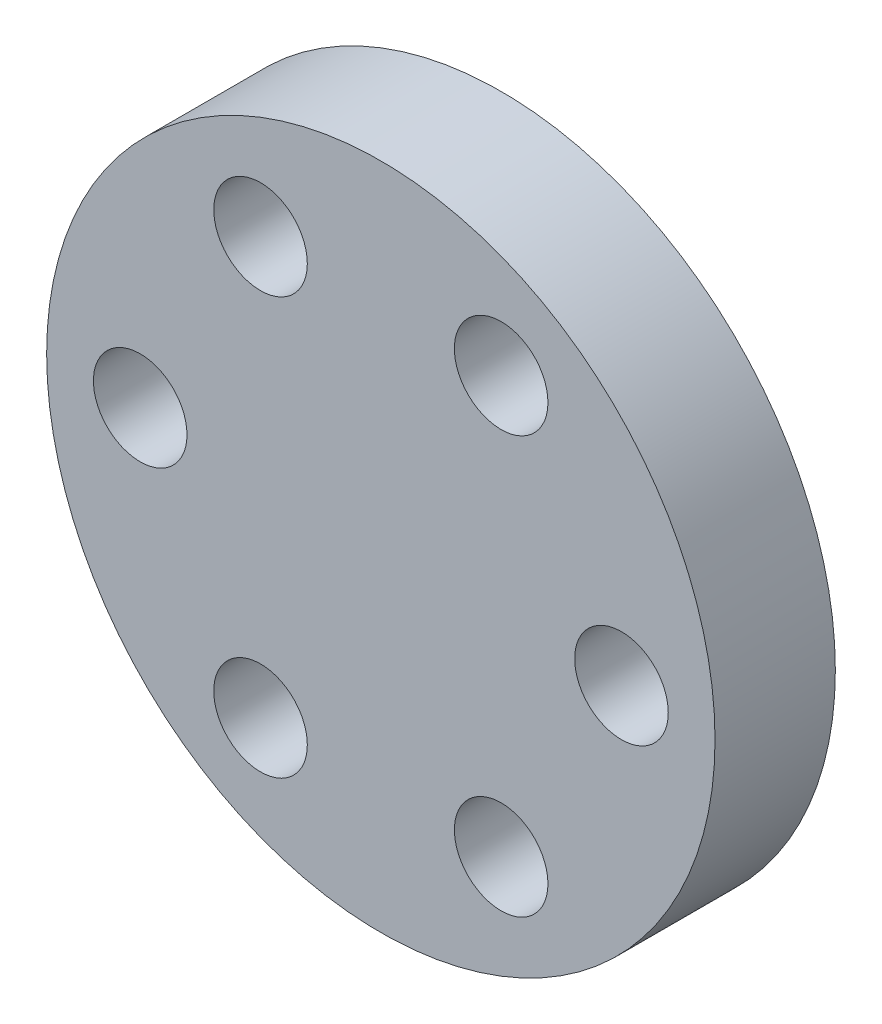
ISO-10303-21;
HEADER;
FILE_DESCRIPTION(('STEP AP214'),'2;1');
FILE_NAME('part.step','',(''),(''),'','','');
FILE_SCHEMA(('AUTOMOTIVE_DESIGN { 1 0 10303 214 1 1 1 1 }'));
ENDSEC;
DATA;
#1=APPLICATION_CONTEXT('core data for automotive mechanical design processes');
#2=APPLICATION_PROTOCOL_DEFINITION('international standard','automotive_design',2000,#1);
#3=PRODUCT_CONTEXT('',#1,'mechanical');
#4=PRODUCT('Part','Part','',(#3));
#5=PRODUCT_RELATED_PRODUCT_CATEGORY('part','',(#4));
#6=PRODUCT_DEFINITION_FORMATION('','',#4);
#7=PRODUCT_DEFINITION_CONTEXT('part definition',#1,'design');
#8=PRODUCT_DEFINITION('design','',#6,#7);
#9=PRODUCT_DEFINITION_SHAPE('','',#8);
#10=(LENGTH_UNIT() NAMED_UNIT(*) SI_UNIT(.MILLI.,.METRE.));
#11=(NAMED_UNIT(*) PLANE_ANGLE_UNIT() SI_UNIT($,.RADIAN.));
#12=(NAMED_UNIT(*) SI_UNIT($,.STERADIAN.) SOLID_ANGLE_UNIT());
#13=UNCERTAINTY_MEASURE_WITH_UNIT(LENGTH_MEASURE(1.E-05),#10,'distance_accuracy_value','');
#14=(GEOMETRIC_REPRESENTATION_CONTEXT(3) GLOBAL_UNCERTAINTY_ASSIGNED_CONTEXT((#13)) GLOBAL_UNIT_ASSIGNED_CONTEXT((#10,
#11,#12)) REPRESENTATION_CONTEXT('',''));
#15=CARTESIAN_POINT('',(0.,0.,0.));
#16=DIRECTION('',(0.,0.,1.));
#17=DIRECTION('',(1.,0.,0.));
#18=AXIS2_PLACEMENT_3D('',#15,#16,#17);
#19=CARTESIAN_POINT('',(0.,0.,28.575));
#20=DIRECTION('',(0.,0.,1.));
#21=DIRECTION('',(1.,0.,0.));
#22=AXIS2_PLACEMENT_3D('',#19,#20,#21);
#23=PLANE('',#22);
#24=CARTESIAN_POINT('',(57.1500000000001,-98.9867036525613,28.575));
#25=DIRECTION('',(0.,0.,1.));
#26=DIRECTION('',(1.,0.,0.));
#27=AXIS2_PLACEMENT_3D('',#24,#25,#26);
#28=CIRCLE('',#27,22.225);
#29=CARTESIAN_POINT('',(79.3750000000001,-98.9867036525613,28.575));
#30=VERTEX_POINT('',#29);
#31=EDGE_CURVE('E86',#30,#30,#28,.T.);
#32=ORIENTED_EDGE('',*,*,#31,.F.);
#33=EDGE_LOOP('',(#32));
#34=FACE_BOUND('',#33,.T.);
#35=CARTESIAN_POINT('',(57.15,98.9867036525613,28.575));
#36=DIRECTION('',(0.,0.,1.));
#37=DIRECTION('',(1.,0.,0.));
#38=AXIS2_PLACEMENT_3D('',#35,#36,#37);
#39=CIRCLE('',#38,22.225);
#40=CARTESIAN_POINT('',(79.375,98.9867036525613,28.575));
#41=VERTEX_POINT('',#40);
#42=EDGE_CURVE('E70',#41,#41,#39,.T.);
#43=ORIENTED_EDGE('',*,*,#42,.F.);
#44=EDGE_LOOP('',(#43));
#45=FACE_BOUND('',#44,.T.);
#46=CARTESIAN_POINT('',(-114.3,0.,28.575));
#47=DIRECTION('',(0.,0.,1.));
#48=DIRECTION('',(1.,0.,0.));
#49=AXIS2_PLACEMENT_3D('',#46,#47,#48);
#50=CIRCLE('',#49,22.225);
#51=CARTESIAN_POINT('',(-92.075,0.,28.575));
#52=VERTEX_POINT('',#51);
#53=EDGE_CURVE('E56',#52,#52,#50,.T.);
#54=ORIENTED_EDGE('',*,*,#53,.F.);
#55=EDGE_LOOP('',(#54));
#56=FACE_BOUND('',#55,.T.);
#57=CARTESIAN_POINT('',(0.,0.,28.575));
#58=DIRECTION('',(0.,0.,1.));
#59=DIRECTION('',(1.,0.,0.));
#60=AXIS2_PLACEMENT_3D('',#57,#58,#59);
#61=CIRCLE('',#60,158.75);
#62=CARTESIAN_POINT('',(158.75,0.,28.575));
#63=VERTEX_POINT('',#62);
#64=EDGE_CURVE('E10',#63,#63,#61,.T.);
#65=ORIENTED_EDGE('',*,*,#64,.T.);
#66=EDGE_LOOP('',(#65));
#67=FACE_BOUND('',#66,.T.);
#68=CARTESIAN_POINT('',(-57.15,98.9867036525613,28.575));
#69=DIRECTION('',(0.,0.,1.));
#70=DIRECTION('',(1.,0.,0.));
#71=AXIS2_PLACEMENT_3D('',#68,#69,#70);
#72=CIRCLE('',#71,22.225);
#73=CARTESIAN_POINT('',(-34.925,98.9867036525613,28.575));
#74=VERTEX_POINT('',#73);
#75=EDGE_CURVE('E62',#74,#74,#72,.T.);
#76=ORIENTED_EDGE('',*,*,#75,.F.);
#77=EDGE_LOOP('',(#76));
#78=FACE_BOUND('',#77,.T.);
#79=CARTESIAN_POINT('',(114.3,0.,28.575));
#80=DIRECTION('',(0.,0.,1.));
#81=DIRECTION('',(1.,0.,0.));
#82=AXIS2_PLACEMENT_3D('',#79,#80,#81);
#83=CIRCLE('',#82,22.225);
#84=CARTESIAN_POINT('',(136.525,0.,28.575));
#85=VERTEX_POINT('',#84);
#86=EDGE_CURVE('E78',#85,#85,#83,.T.);
#87=ORIENTED_EDGE('',*,*,#86,.F.);
#88=EDGE_LOOP('',(#87));
#89=FACE_BOUND('',#88,.T.);
#90=CARTESIAN_POINT('',(-57.15,-98.9867036525613,28.575));
#91=DIRECTION('',(0.,0.,1.));
#92=DIRECTION('',(1.,0.,0.));
#93=AXIS2_PLACEMENT_3D('',#90,#91,#92);
#94=CIRCLE('',#93,22.225);
#95=CARTESIAN_POINT('',(-34.925,-98.9867036525613,28.575));
#96=VERTEX_POINT('',#95);
#97=EDGE_CURVE('E94',#96,#96,#94,.T.);
#98=ORIENTED_EDGE('',*,*,#97,.F.);
#99=EDGE_LOOP('',(#98));
#100=FACE_BOUND('',#99,.T.);
#101=ADVANCED_FACE('F43',(#34,#45,#56,#67,#78,#89,#100),#23,.T.);
#102=CARTESIAN_POINT('',(0.,0.,-28.575));
#103=DIRECTION('',(0.,0.,1.));
#104=DIRECTION('',(1.,0.,0.));
#105=AXIS2_PLACEMENT_3D('',#102,#103,#104);
#106=PLANE('',#105);
#107=CARTESIAN_POINT('',(0.,0.,-28.575));
#108=DIRECTION('',(0.,0.,1.));
#109=DIRECTION('',(1.,0.,0.));
#110=AXIS2_PLACEMENT_3D('',#107,#108,#109);
#111=CIRCLE('',#110,158.75);
#112=CARTESIAN_POINT('',(158.75,0.,-28.575));
#113=VERTEX_POINT('',#112);
#114=EDGE_CURVE('E47',#113,#113,#111,.T.);
#115=ORIENTED_EDGE('',*,*,#114,.F.);
#116=EDGE_LOOP('',(#115));
#117=FACE_BOUND('',#116,.T.);
#118=CARTESIAN_POINT('',(-114.3,0.,-28.575));
#119=DIRECTION('',(0.,0.,1.));
#120=DIRECTION('',(1.,0.,0.));
#121=AXIS2_PLACEMENT_3D('',#118,#119,#120);
#122=CIRCLE('',#121,22.225);
#123=CARTESIAN_POINT('',(-92.075,0.,-28.575));
#124=VERTEX_POINT('',#123);
#125=EDGE_CURVE('E58',#124,#124,#122,.T.);
#126=ORIENTED_EDGE('',*,*,#125,.T.);
#127=EDGE_LOOP('',(#126));
#128=FACE_BOUND('',#127,.T.);
#129=CARTESIAN_POINT('',(-57.15,98.9867036525613,-28.575));
#130=DIRECTION('',(0.,0.,1.));
#131=DIRECTION('',(1.,0.,0.));
#132=AXIS2_PLACEMENT_3D('',#129,#130,#131);
#133=CIRCLE('',#132,22.225);
#134=CARTESIAN_POINT('',(-34.925,98.9867036525613,-28.575));
#135=VERTEX_POINT('',#134);
#136=EDGE_CURVE('E66',#135,#135,#133,.T.);
#137=ORIENTED_EDGE('',*,*,#136,.T.);
#138=EDGE_LOOP('',(#137));
#139=FACE_BOUND('',#138,.T.);
#140=CARTESIAN_POINT('',(57.15,98.9867036525613,-28.575));
#141=DIRECTION('',(0.,0.,1.));
#142=DIRECTION('',(1.,0.,0.));
#143=AXIS2_PLACEMENT_3D('',#140,#141,#142);
#144=CIRCLE('',#143,22.225);
#145=CARTESIAN_POINT('',(79.375,98.9867036525613,-28.575));
#146=VERTEX_POINT('',#145);
#147=EDGE_CURVE('E74',#146,#146,#144,.T.);
#148=ORIENTED_EDGE('',*,*,#147,.T.);
#149=EDGE_LOOP('',(#148));
#150=FACE_BOUND('',#149,.T.);
#151=CARTESIAN_POINT('',(114.3,0.,-28.575));
#152=DIRECTION('',(0.,0.,1.));
#153=DIRECTION('',(1.,0.,0.));
#154=AXIS2_PLACEMENT_3D('',#151,#152,#153);
#155=CIRCLE('',#154,22.225);
#156=CARTESIAN_POINT('',(136.525,0.,-28.575));
#157=VERTEX_POINT('',#156);
#158=EDGE_CURVE('E82',#157,#157,#155,.T.);
#159=ORIENTED_EDGE('',*,*,#158,.T.);
#160=EDGE_LOOP('',(#159));
#161=FACE_BOUND('',#160,.T.);
#162=CARTESIAN_POINT('',(57.1500000000001,-98.9867036525613,-28.575));
#163=DIRECTION('',(0.,0.,1.));
#164=DIRECTION('',(1.,0.,0.));
#165=AXIS2_PLACEMENT_3D('',#162,#163,#164);
#166=CIRCLE('',#165,22.225);
#167=CARTESIAN_POINT('',(79.3750000000001,-98.9867036525613,-28.575));
#168=VERTEX_POINT('',#167);
#169=EDGE_CURVE('E90',#168,#168,#166,.T.);
#170=ORIENTED_EDGE('',*,*,#169,.T.);
#171=EDGE_LOOP('',(#170));
#172=FACE_BOUND('',#171,.T.);
#173=CARTESIAN_POINT('',(-57.15,-98.9867036525613,-28.575));
#174=DIRECTION('',(0.,0.,1.));
#175=DIRECTION('',(1.,0.,0.));
#176=AXIS2_PLACEMENT_3D('',#173,#174,#175);
#177=CIRCLE('',#176,22.225);
#178=CARTESIAN_POINT('',(-34.925,-98.9867036525613,-28.575));
#179=VERTEX_POINT('',#178);
#180=EDGE_CURVE('E98',#179,#179,#177,.T.);
#181=ORIENTED_EDGE('',*,*,#180,.T.);
#182=EDGE_LOOP('',(#181));
#183=FACE_BOUND('',#182,.T.);
#184=ADVANCED_FACE('F110',(#117,#128,#139,#150,#161,#172,#183),#106,.F.);
#185=CARTESIAN_POINT('',(0.,0.,28.575));
#186=DIRECTION('',(0.,0.,-1.));
#187=DIRECTION('',(-1.,0.,0.));
#188=AXIS2_PLACEMENT_3D('',#185,#186,#187);
#189=CYLINDRICAL_SURFACE('',#188,158.75);
#190=ORIENTED_EDGE('',*,*,#64,.F.);
#191=EDGE_LOOP('',(#190));
#192=FACE_BOUND('',#191,.T.);
#193=ORIENTED_EDGE('',*,*,#114,.T.);
#194=EDGE_LOOP('',(#193));
#195=FACE_BOUND('',#194,.T.);
#196=ADVANCED_FACE('F45',(#192,#195),#189,.T.);
#197=CARTESIAN_POINT('',(-114.3,0.,28.575));
#198=DIRECTION('',(0.,0.,-1.));
#199=DIRECTION('',(-1.,0.,0.));
#200=AXIS2_PLACEMENT_3D('',#197,#198,#199);
#201=CYLINDRICAL_SURFACE('',#200,22.225);
#202=ORIENTED_EDGE('',*,*,#53,.T.);
#203=EDGE_LOOP('',(#202));
#204=FACE_BOUND('',#203,.T.);
#205=ORIENTED_EDGE('',*,*,#125,.F.);
#206=EDGE_LOOP('',(#205));
#207=FACE_BOUND('',#206,.T.);
#208=ADVANCED_FACE('F120',(#204,#207),#201,.F.);
#209=CARTESIAN_POINT('',(-57.15,98.9867036525613,28.575));
#210=DIRECTION('',(0.,0.,-1.));
#211=DIRECTION('',(-1.,0.,0.));
#212=AXIS2_PLACEMENT_3D('',#209,#210,#211);
#213=CYLINDRICAL_SURFACE('',#212,22.225);
#214=ORIENTED_EDGE('',*,*,#75,.T.);
#215=EDGE_LOOP('',(#214));
#216=FACE_BOUND('',#215,.T.);
#217=ORIENTED_EDGE('',*,*,#136,.F.);
#218=EDGE_LOOP('',(#217));
#219=FACE_BOUND('',#218,.T.);
#220=ADVANCED_FACE('F123',(#216,#219),#213,.F.);
#221=CARTESIAN_POINT('',(57.15,98.9867036525613,28.575));
#222=DIRECTION('',(0.,0.,-1.));
#223=DIRECTION('',(-1.,0.,0.));
#224=AXIS2_PLACEMENT_3D('',#221,#222,#223);
#225=CYLINDRICAL_SURFACE('',#224,22.225);
#226=ORIENTED_EDGE('',*,*,#42,.T.);
#227=EDGE_LOOP('',(#226));
#228=FACE_BOUND('',#227,.T.);
#229=ORIENTED_EDGE('',*,*,#147,.F.);
#230=EDGE_LOOP('',(#229));
#231=FACE_BOUND('',#230,.T.);
#232=ADVANCED_FACE('F127',(#228,#231),#225,.F.);
#233=CARTESIAN_POINT('',(114.3,0.,28.575));
#234=DIRECTION('',(0.,0.,-1.));
#235=DIRECTION('',(-1.,0.,0.));
#236=AXIS2_PLACEMENT_3D('',#233,#234,#235);
#237=CYLINDRICAL_SURFACE('',#236,22.225);
#238=ORIENTED_EDGE('',*,*,#86,.T.);
#239=EDGE_LOOP('',(#238));
#240=FACE_BOUND('',#239,.T.);
#241=ORIENTED_EDGE('',*,*,#158,.F.);
#242=EDGE_LOOP('',(#241));
#243=FACE_BOUND('',#242,.T.);
#244=ADVANCED_FACE('F131',(#240,#243),#237,.F.);
#245=CARTESIAN_POINT('',(57.1500000000001,-98.9867036525613,28.575));
#246=DIRECTION('',(0.,0.,-1.));
#247=DIRECTION('',(-1.,0.,0.));
#248=AXIS2_PLACEMENT_3D('',#245,#246,#247);
#249=CYLINDRICAL_SURFACE('',#248,22.225);
#250=ORIENTED_EDGE('',*,*,#31,.T.);
#251=EDGE_LOOP('',(#250));
#252=FACE_BOUND('',#251,.T.);
#253=ORIENTED_EDGE('',*,*,#169,.F.);
#254=EDGE_LOOP('',(#253));
#255=FACE_BOUND('',#254,.T.);
#256=ADVANCED_FACE('F135',(#252,#255),#249,.F.);
#257=CARTESIAN_POINT('',(-57.15,-98.9867036525613,28.575));
#258=DIRECTION('',(0.,0.,-1.));
#259=DIRECTION('',(-1.,0.,0.));
#260=AXIS2_PLACEMENT_3D('',#257,#258,#259);
#261=CYLINDRICAL_SURFACE('',#260,22.225);
#262=ORIENTED_EDGE('',*,*,#97,.T.);
#263=EDGE_LOOP('',(#262));
#264=FACE_BOUND('',#263,.T.);
#265=ORIENTED_EDGE('',*,*,#180,.F.);
#266=EDGE_LOOP('',(#265));
#267=FACE_BOUND('',#266,.T.);
#268=ADVANCED_FACE('F106',(#264,#267),#261,.F.);
#269=CLOSED_SHELL('',(#101,#184,#196,#208,#220,#232,#244,#256,#268));
#270=MANIFOLD_SOLID_BREP('B2',#269);
#271=ADVANCED_BREP_SHAPE_REPRESENTATION('',(#18,#270),#14);
#272=SHAPE_DEFINITION_REPRESENTATION(#9,#271);
ENDSEC;
END-ISO-10303-21;
